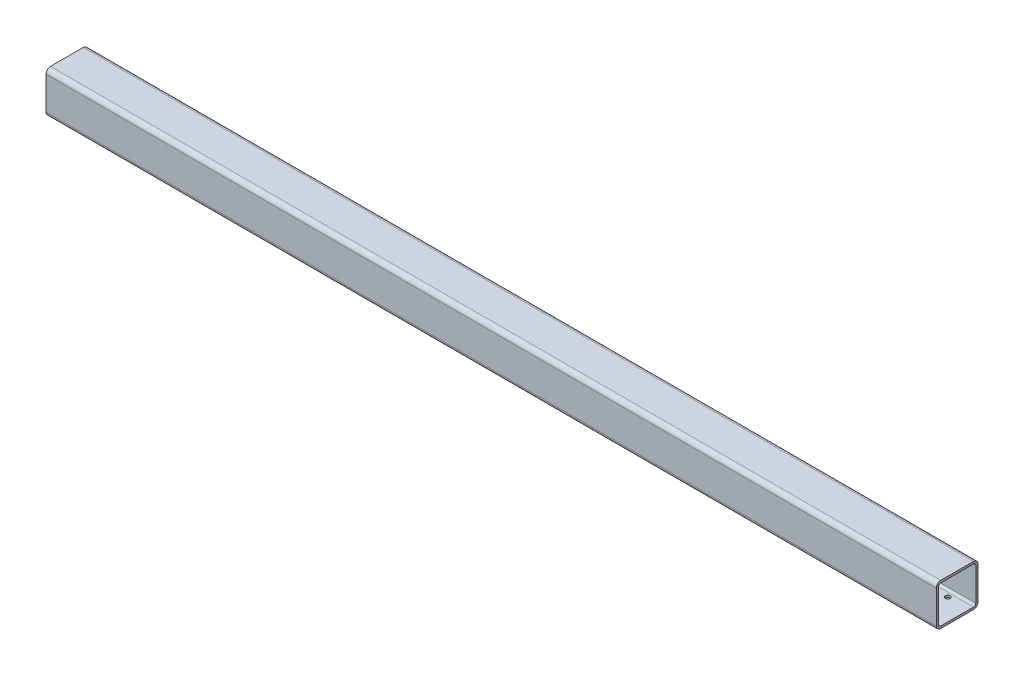
ISO-10303-21;
HEADER;
FILE_DESCRIPTION(('STEP AP214'),'2;1');
FILE_NAME('part.step','',(''),(''),'','','');
FILE_SCHEMA(('AUTOMOTIVE_DESIGN { 1 0 10303 214 1 1 1 1 }'));
ENDSEC;
DATA;
#1=APPLICATION_CONTEXT('core data for automotive mechanical design processes');
#2=APPLICATION_PROTOCOL_DEFINITION('international standard','automotive_design',2000,#1);
#3=PRODUCT_CONTEXT('',#1,'mechanical');
#4=PRODUCT('Part','Part','',(#3));
#5=PRODUCT_RELATED_PRODUCT_CATEGORY('part','',(#4));
#6=PRODUCT_DEFINITION_FORMATION('','',#4);
#7=PRODUCT_DEFINITION_CONTEXT('part definition',#1,'design');
#8=PRODUCT_DEFINITION('design','',#6,#7);
#9=PRODUCT_DEFINITION_SHAPE('','',#8);
#10=(LENGTH_UNIT() NAMED_UNIT(*) SI_UNIT(.MILLI.,.METRE.));
#11=(NAMED_UNIT(*) PLANE_ANGLE_UNIT() SI_UNIT($,.RADIAN.));
#12=(NAMED_UNIT(*) SI_UNIT($,.STERADIAN.) SOLID_ANGLE_UNIT());
#13=UNCERTAINTY_MEASURE_WITH_UNIT(LENGTH_MEASURE(1.E-05),#10,'distance_accuracy_value','');
#14=(GEOMETRIC_REPRESENTATION_CONTEXT(3) GLOBAL_UNCERTAINTY_ASSIGNED_CONTEXT((#13)) GLOBAL_UNIT_ASSIGNED_CONTEXT((#10,
#11,#12)) REPRESENTATION_CONTEXT('',''));
#15=CARTESIAN_POINT('',(0.,0.,0.));
#16=DIRECTION('',(0.,0.,1.));
#17=DIRECTION('',(1.,0.,0.));
#18=AXIS2_PLACEMENT_3D('',#15,#16,#17);
#19=CARTESIAN_POINT('',(-539.,-29.999999999859,-17.5));
#20=DIRECTION('',(0.,-1.,0.));
#21=DIRECTION('',(1.,0.,0.));
#22=AXIS2_PLACEMENT_3D('',#19,#20,#21);
#23=CONICAL_SURFACE('',#22,3.99999999983265,1.02974425864578);
#24=CARTESIAN_POINT('',(-539.,-27.5965575238217,-17.5000000002399));
#25=VERTEX_POINT('',#24);
#26=VERTEX_LOOP('',#25);
#27=FACE_BOUND('',#26,.T.);
#28=CARTESIAN_POINT('',(-539.,-29.9999999999369,-17.5));
#29=DIRECTION('',(0.,-1.,0.));
#30=DIRECTION('',(1.,0.,0.));
#31=AXIS2_PLACEMENT_3D('',#28,#29,#30);
#32=CIRCLE('',#31,3.99999999996226);
#33=CARTESIAN_POINT('',(-535.000000000037,-29.9999999999369,-17.5));
#34=VERTEX_POINT('',#33);
#35=EDGE_CURVE('E156',#34,#34,#32,.T.);
#36=ORIENTED_EDGE('',*,*,#35,.T.);
#37=EDGE_LOOP('',(#36));
#38=FACE_BOUND('',#37,.T.);
#39=ADVANCED_FACE('F17',(#27,#38),#23,.F.);
#40=CARTESIAN_POINT('',(538.999999999999,-29.999999999859,-17.5));
#41=DIRECTION('',(0.,-1.,0.));
#42=DIRECTION('',(1.,0.,0.));
#43=AXIS2_PLACEMENT_3D('',#40,#41,#42);
#44=CONICAL_SURFACE('',#43,3.99999999983265,1.02974425864578);
#45=CARTESIAN_POINT('',(538.999999999999,-27.5965575238217,-17.5000000002399));
#46=VERTEX_POINT('',#45);
#47=VERTEX_LOOP('',#46);
#48=FACE_BOUND('',#47,.T.);
#49=CARTESIAN_POINT('',(538.999999999999,-29.9999999999369,-17.5));
#50=DIRECTION('',(0.,-1.,0.));
#51=DIRECTION('',(1.,0.,0.));
#52=AXIS2_PLACEMENT_3D('',#49,#50,#51);
#53=CIRCLE('',#52,3.99999999996226);
#54=CARTESIAN_POINT('',(542.999999999961,-29.9999999999369,-17.5));
#55=VERTEX_POINT('',#54);
#56=EDGE_CURVE('E252',#55,#55,#53,.T.);
#57=ORIENTED_EDGE('',*,*,#56,.T.);
#58=EDGE_LOOP('',(#57));
#59=FACE_BOUND('',#58,.T.);
#60=ADVANCED_FACE('F410',(#48,#59),#44,.F.);
#61=CARTESIAN_POINT('',(538.999999999999,-29.999999999859,17.5000000000004));
#62=DIRECTION('',(0.,-1.,0.));
#63=DIRECTION('',(1.,0.,0.));
#64=AXIS2_PLACEMENT_3D('',#61,#62,#63);
#65=CONICAL_SURFACE('',#64,3.99999999975122,1.02974425859438);
#66=CARTESIAN_POINT('',(538.999999999999,-27.5965575238217,17.4999999998136));
#67=VERTEX_POINT('',#66);
#68=VERTEX_LOOP('',#67);
#69=FACE_BOUND('',#68,.T.);
#70=CARTESIAN_POINT('',(538.999999999999,-29.9999999999858,17.5000000000004));
#71=DIRECTION('',(0.,-1.,0.));
#72=DIRECTION('',(1.,0.,0.));
#73=AXIS2_PLACEMENT_3D('',#70,#71,#72);
#74=CIRCLE('',#73,3.99999999996226);
#75=CARTESIAN_POINT('',(542.999999999961,-29.9999999999858,17.5000000000004));
#76=VERTEX_POINT('',#75);
#77=EDGE_CURVE('E249',#76,#76,#74,.T.);
#78=ORIENTED_EDGE('',*,*,#77,.T.);
#79=EDGE_LOOP('',(#78));
#80=FACE_BOUND('',#79,.T.);
#81=ADVANCED_FACE('F296',(#69,#80),#65,.F.);
#82=CARTESIAN_POINT('',(-539.,-29.999999999859,17.4999999999993));
#83=DIRECTION('',(0.,-1.,0.));
#84=DIRECTION('',(1.,0.,0.));
#85=AXIS2_PLACEMENT_3D('',#82,#83,#84);
#86=CONICAL_SURFACE('',#85,3.99999999975011,1.02974425859413);
#87=CARTESIAN_POINT('',(-539.,-27.5965575238217,17.4999999998136));
#88=VERTEX_POINT('',#87);
#89=VERTEX_LOOP('',#88);
#90=FACE_BOUND('',#89,.T.);
#91=CARTESIAN_POINT('',(-539.,-29.9999999999865,17.4999999999993));
#92=DIRECTION('',(0.,-1.,0.));
#93=DIRECTION('',(1.,0.,0.));
#94=AXIS2_PLACEMENT_3D('',#91,#92,#93);
#95=CIRCLE('',#94,3.99999999996226);
#96=CARTESIAN_POINT('',(-535.000000000037,-29.9999999999865,17.4999999999993));
#97=VERTEX_POINT('',#96);
#98=EDGE_CURVE('E246',#97,#97,#95,.T.);
#99=ORIENTED_EDGE('',*,*,#98,.T.);
#100=EDGE_LOOP('',(#99));
#101=FACE_BOUND('',#100,.T.);
#102=ADVANCED_FACE('F285',(#90,#101),#86,.F.);
#103=CARTESIAN_POINT('',(-609.,-40.,-17.5));
#104=DIRECTION('',(0.,-1.,0.));
#105=DIRECTION('',(0.,0.,-1.));
#106=AXIS2_PLACEMENT_3D('',#103,#104,#105);
#107=CYLINDRICAL_SURFACE('',#106,3.39999999999996);
#108=CARTESIAN_POINT('',(-609.,-30.,-17.5));
#109=DIRECTION('',(0.,-1.,0.));
#110=DIRECTION('',(0.,0.,-1.));
#111=AXIS2_PLACEMENT_3D('',#108,#109,#110);
#112=CIRCLE('',#111,3.39999999999996);
#113=CARTESIAN_POINT('',(-609.,-30.,-20.9));
#114=VERTEX_POINT('',#113);
#115=EDGE_CURVE('E243',#114,#114,#112,.T.);
#116=ORIENTED_EDGE('',*,*,#115,.T.);
#117=EDGE_LOOP('',(#116));
#118=FACE_BOUND('',#117,.T.);
#119=CARTESIAN_POINT('',(-609.,-26.7999999999999,-17.5));
#120=DIRECTION('',(0.,-1.,0.));
#121=DIRECTION('',(0.,0.,-1.));
#122=AXIS2_PLACEMENT_3D('',#119,#120,#121);
#123=CIRCLE('',#122,3.39999999999996);
#124=CARTESIAN_POINT('',(-609.,-26.7999999999999,-20.9));
#125=VERTEX_POINT('',#124);
#126=EDGE_CURVE('E20',#125,#125,#123,.T.);
#127=ORIENTED_EDGE('',*,*,#126,.F.);
#128=EDGE_LOOP('',(#127));
#129=FACE_BOUND('',#128,.T.);
#130=ADVANCED_FACE('F282',(#118,#129),#107,.F.);
#131=CARTESIAN_POINT('',(-609.,-40.,17.5));
#132=DIRECTION('',(0.,-1.,0.));
#133=DIRECTION('',(0.,0.,-1.));
#134=AXIS2_PLACEMENT_3D('',#131,#132,#133);
#135=CYLINDRICAL_SURFACE('',#134,3.39999999999996);
#136=CARTESIAN_POINT('',(-609.,-30.,17.5));
#137=DIRECTION('',(0.,-1.,0.));
#138=DIRECTION('',(0.,0.,-1.));
#139=AXIS2_PLACEMENT_3D('',#136,#137,#138);
#140=CIRCLE('',#139,3.39999999999996);
#141=CARTESIAN_POINT('',(-609.,-30.,14.1));
#142=VERTEX_POINT('',#141);
#143=EDGE_CURVE('E240',#142,#142,#140,.T.);
#144=ORIENTED_EDGE('',*,*,#143,.T.);
#145=EDGE_LOOP('',(#144));
#146=FACE_BOUND('',#145,.T.);
#147=CARTESIAN_POINT('',(-609.,-26.7999999999999,17.5));
#148=DIRECTION('',(0.,-1.,0.));
#149=DIRECTION('',(0.,0.,-1.));
#150=AXIS2_PLACEMENT_3D('',#147,#148,#149);
#151=CIRCLE('',#150,3.39999999999996);
#152=CARTESIAN_POINT('',(-609.,-26.7999999999999,14.1));
#153=VERTEX_POINT('',#152);
#154=EDGE_CURVE('E273',#153,#153,#151,.T.);
#155=ORIENTED_EDGE('',*,*,#154,.F.);
#156=EDGE_LOOP('',(#155));
#157=FACE_BOUND('',#156,.T.);
#158=ADVANCED_FACE('F284',(#146,#157),#135,.F.);
#159=CARTESIAN_POINT('',(-469.,-40.,17.5));
#160=DIRECTION('',(0.,-1.,0.));
#161=DIRECTION('',(0.,0.,-1.));
#162=AXIS2_PLACEMENT_3D('',#159,#160,#161);
#163=CYLINDRICAL_SURFACE('',#162,3.40000000000001);
#164=CARTESIAN_POINT('',(-469.,-30.,17.5));
#165=DIRECTION('',(0.,-1.,0.));
#166=DIRECTION('',(0.,0.,-1.));
#167=AXIS2_PLACEMENT_3D('',#164,#165,#166);
#168=CIRCLE('',#167,3.40000000000001);
#169=CARTESIAN_POINT('',(-469.,-30.,14.1));
#170=VERTEX_POINT('',#169);
#171=EDGE_CURVE('E237',#170,#170,#168,.T.);
#172=ORIENTED_EDGE('',*,*,#171,.T.);
#173=EDGE_LOOP('',(#172));
#174=FACE_BOUND('',#173,.T.);
#175=CARTESIAN_POINT('',(-469.,-26.7999999999999,17.5));
#176=DIRECTION('',(0.,-1.,0.));
#177=DIRECTION('',(0.,0.,-1.));
#178=AXIS2_PLACEMENT_3D('',#175,#176,#177);
#179=CIRCLE('',#178,3.40000000000001);
#180=CARTESIAN_POINT('',(-469.,-26.7999999999999,14.1));
#181=VERTEX_POINT('',#180);
#182=EDGE_CURVE('E271',#181,#181,#179,.T.);
#183=ORIENTED_EDGE('',*,*,#182,.F.);
#184=EDGE_LOOP('',(#183));
#185=FACE_BOUND('',#184,.T.);
#186=ADVANCED_FACE('F293',(#174,#185),#163,.F.);
#187=CARTESIAN_POINT('',(-469.,-40.,-17.5));
#188=DIRECTION('',(0.,-1.,0.));
#189=DIRECTION('',(0.,0.,-1.));
#190=AXIS2_PLACEMENT_3D('',#187,#188,#189);
#191=CYLINDRICAL_SURFACE('',#190,3.40000000000001);
#192=CARTESIAN_POINT('',(-469.,-30.,-17.5));
#193=DIRECTION('',(0.,-1.,0.));
#194=DIRECTION('',(0.,0.,-1.));
#195=AXIS2_PLACEMENT_3D('',#192,#193,#194);
#196=CIRCLE('',#195,3.40000000000001);
#197=CARTESIAN_POINT('',(-469.,-30.,-20.9));
#198=VERTEX_POINT('',#197);
#199=EDGE_CURVE('E234',#198,#198,#196,.T.);
#200=ORIENTED_EDGE('',*,*,#199,.T.);
#201=EDGE_LOOP('',(#200));
#202=FACE_BOUND('',#201,.T.);
#203=CARTESIAN_POINT('',(-469.,-26.7999999999999,-17.5));
#204=DIRECTION('',(0.,-1.,0.));
#205=DIRECTION('',(0.,0.,-1.));
#206=AXIS2_PLACEMENT_3D('',#203,#204,#205);
#207=CIRCLE('',#206,3.40000000000001);
#208=CARTESIAN_POINT('',(-469.,-26.7999999999999,-20.9));
#209=VERTEX_POINT('',#208);
#210=EDGE_CURVE('E268',#209,#209,#207,.T.);
#211=ORIENTED_EDGE('',*,*,#210,.F.);
#212=EDGE_LOOP('',(#211));
#213=FACE_BOUND('',#212,.T.);
#214=ADVANCED_FACE('F382',(#202,#213),#191,.F.);
#215=CARTESIAN_POINT('',(469.,-40.,-17.5));
#216=DIRECTION('',(0.,-1.,0.));
#217=DIRECTION('',(0.,0.,-1.));
#218=AXIS2_PLACEMENT_3D('',#215,#216,#217);
#219=CYLINDRICAL_SURFACE('',#218,3.40000000000001);
#220=CARTESIAN_POINT('',(469.,-30.,-17.5));
#221=DIRECTION('',(0.,-1.,0.));
#222=DIRECTION('',(0.,0.,-1.));
#223=AXIS2_PLACEMENT_3D('',#220,#221,#222);
#224=CIRCLE('',#223,3.40000000000001);
#225=CARTESIAN_POINT('',(469.,-30.,-20.9));
#226=VERTEX_POINT('',#225);
#227=EDGE_CURVE('E231',#226,#226,#224,.T.);
#228=ORIENTED_EDGE('',*,*,#227,.T.);
#229=EDGE_LOOP('',(#228));
#230=FACE_BOUND('',#229,.T.);
#231=CARTESIAN_POINT('',(469.,-26.7999999999999,-17.5));
#232=DIRECTION('',(0.,-1.,0.));
#233=DIRECTION('',(0.,0.,-1.));
#234=AXIS2_PLACEMENT_3D('',#231,#232,#233);
#235=CIRCLE('',#234,3.40000000000001);
#236=CARTESIAN_POINT('',(469.,-26.7999999999999,-20.9));
#237=VERTEX_POINT('',#236);
#238=EDGE_CURVE('E265',#237,#237,#235,.T.);
#239=ORIENTED_EDGE('',*,*,#238,.F.);
#240=EDGE_LOOP('',(#239));
#241=FACE_BOUND('',#240,.T.);
#242=ADVANCED_FACE('F378',(#230,#241),#219,.F.);
#243=CARTESIAN_POINT('',(609.,-40.,-17.5));
#244=DIRECTION('',(0.,-1.,0.));
#245=DIRECTION('',(0.,0.,-1.));
#246=AXIS2_PLACEMENT_3D('',#243,#244,#245);
#247=CYLINDRICAL_SURFACE('',#246,3.39999999999996);
#248=CARTESIAN_POINT('',(609.,-30.,-17.5));
#249=DIRECTION('',(0.,-1.,0.));
#250=DIRECTION('',(0.,0.,-1.));
#251=AXIS2_PLACEMENT_3D('',#248,#249,#250);
#252=CIRCLE('',#251,3.39999999999996);
#253=CARTESIAN_POINT('',(609.,-30.,-20.9));
#254=VERTEX_POINT('',#253);
#255=EDGE_CURVE('E228',#254,#254,#252,.T.);
#256=ORIENTED_EDGE('',*,*,#255,.T.);
#257=EDGE_LOOP('',(#256));
#258=FACE_BOUND('',#257,.T.);
#259=CARTESIAN_POINT('',(609.,-26.7999999999999,-17.5));
#260=DIRECTION('',(0.,-1.,0.));
#261=DIRECTION('',(0.,0.,-1.));
#262=AXIS2_PLACEMENT_3D('',#259,#260,#261);
#263=CIRCLE('',#262,3.39999999999996);
#264=CARTESIAN_POINT('',(609.,-26.7999999999999,-20.9));
#265=VERTEX_POINT('',#264);
#266=EDGE_CURVE('E262',#265,#265,#263,.T.);
#267=ORIENTED_EDGE('',*,*,#266,.F.);
#268=EDGE_LOOP('',(#267));
#269=FACE_BOUND('',#268,.T.);
#270=ADVANCED_FACE('F374',(#258,#269),#247,.F.);
#271=CARTESIAN_POINT('',(609.,-40.,17.5));
#272=DIRECTION('',(0.,-1.,0.));
#273=DIRECTION('',(0.,0.,-1.));
#274=AXIS2_PLACEMENT_3D('',#271,#272,#273);
#275=CYLINDRICAL_SURFACE('',#274,3.39999999999996);
#276=CARTESIAN_POINT('',(609.,-30.,17.5));
#277=DIRECTION('',(0.,-1.,0.));
#278=DIRECTION('',(0.,0.,-1.));
#279=AXIS2_PLACEMENT_3D('',#276,#277,#278);
#280=CIRCLE('',#279,3.39999999999996);
#281=CARTESIAN_POINT('',(609.,-30.,14.1));
#282=VERTEX_POINT('',#281);
#283=EDGE_CURVE('E225',#282,#282,#280,.T.);
#284=ORIENTED_EDGE('',*,*,#283,.T.);
#285=EDGE_LOOP('',(#284));
#286=FACE_BOUND('',#285,.T.);
#287=CARTESIAN_POINT('',(609.,-26.7999999999999,17.5));
#288=DIRECTION('',(0.,-1.,0.));
#289=DIRECTION('',(0.,0.,-1.));
#290=AXIS2_PLACEMENT_3D('',#287,#288,#289);
#291=CIRCLE('',#290,3.39999999999996);
#292=CARTESIAN_POINT('',(609.,-26.7999999999999,14.1));
#293=VERTEX_POINT('',#292);
#294=EDGE_CURVE('E259',#293,#293,#291,.T.);
#295=ORIENTED_EDGE('',*,*,#294,.F.);
#296=EDGE_LOOP('',(#295));
#297=FACE_BOUND('',#296,.T.);
#298=ADVANCED_FACE('F370',(#286,#297),#275,.F.);
#299=CARTESIAN_POINT('',(469.,-40.,17.5));
#300=DIRECTION('',(0.,-1.,0.));
#301=DIRECTION('',(0.,0.,-1.));
#302=AXIS2_PLACEMENT_3D('',#299,#300,#301);
#303=CYLINDRICAL_SURFACE('',#302,3.40000000000001);
#304=CARTESIAN_POINT('',(469.,-30.,17.5));
#305=DIRECTION('',(0.,-1.,0.));
#306=DIRECTION('',(0.,0.,-1.));
#307=AXIS2_PLACEMENT_3D('',#304,#305,#306);
#308=CIRCLE('',#307,3.40000000000001);
#309=CARTESIAN_POINT('',(469.,-30.,14.1));
#310=VERTEX_POINT('',#309);
#311=EDGE_CURVE('E153',#310,#310,#308,.T.);
#312=ORIENTED_EDGE('',*,*,#311,.T.);
#313=EDGE_LOOP('',(#312));
#314=FACE_BOUND('',#313,.T.);
#315=CARTESIAN_POINT('',(469.,-26.7999999999999,17.5));
#316=DIRECTION('',(0.,-1.,0.));
#317=DIRECTION('',(0.,0.,-1.));
#318=AXIS2_PLACEMENT_3D('',#315,#316,#317);
#319=CIRCLE('',#318,3.40000000000001);
#320=CARTESIAN_POINT('',(469.,-26.7999999999999,14.1));
#321=VERTEX_POINT('',#320);
#322=EDGE_CURVE('E182',#321,#321,#319,.T.);
#323=ORIENTED_EDGE('',*,*,#322,.F.);
#324=EDGE_LOOP('',(#323));
#325=FACE_BOUND('',#324,.T.);
#326=ADVANCED_FACE('F366',(#314,#325),#303,.F.);
#327=CARTESIAN_POINT('',(670.,-23.6000000000001,23.6));
#328=DIRECTION('',(-1.,0.,0.));
#329=DIRECTION('',(0.,0.,1.));
#330=AXIS2_PLACEMENT_3D('',#327,#328,#329);
#331=CYLINDRICAL_SURFACE('',#330,3.19999999999993);
#332=CARTESIAN_POINT('',(-640.,-23.6000000000001,23.6));
#333=DIRECTION('',(-1.,0.,0.));
#334=DIRECTION('',(0.,0.,1.));
#335=AXIS2_PLACEMENT_3D('',#332,#333,#334);
#336=CIRCLE('',#335,3.19999999999993);
#337=CARTESIAN_POINT('',(-640.,-23.6000000000001,26.7999999999999));
#338=VERTEX_POINT('',#337);
#339=CARTESIAN_POINT('',(-640.,-26.7999999999999,23.6));
#340=VERTEX_POINT('',#339);
#341=EDGE_CURVE('E205',#338,#340,#336,.F.);
#342=ORIENTED_EDGE('',*,*,#341,.F.);
#343=DIRECTION('',(1.,0.,0.));
#344=VECTOR('',#343,1.);
#345=CARTESIAN_POINT('',(670.,-23.6000000000001,26.7999999999999));
#346=LINE('',#345,#344);
#347=CARTESIAN_POINT('',(640.,-23.6000000000001,26.7999999999999));
#348=VERTEX_POINT('',#347);
#349=EDGE_CURVE('E170',#348,#338,#346,.F.);
#350=ORIENTED_EDGE('',*,*,#349,.F.);
#351=CARTESIAN_POINT('',(640.,-23.6000000000001,23.6));
#352=DIRECTION('',(-1.,0.,0.));
#353=DIRECTION('',(0.,0.,1.));
#354=AXIS2_PLACEMENT_3D('',#351,#352,#353);
#355=CIRCLE('',#354,3.19999999999993);
#356=CARTESIAN_POINT('',(640.,-26.7999999999999,23.6));
#357=VERTEX_POINT('',#356);
#358=EDGE_CURVE('E221',#357,#348,#355,.T.);
#359=ORIENTED_EDGE('',*,*,#358,.F.);
#360=DIRECTION('',(1.,0.,0.));
#361=VECTOR('',#360,1.);
#362=CARTESIAN_POINT('',(670.,-26.7999999999999,23.6));
#363=LINE('',#362,#361);
#364=EDGE_CURVE('E180',#340,#357,#363,.T.);
#365=ORIENTED_EDGE('',*,*,#364,.F.);
#366=EDGE_LOOP('',(#342,#350,#359,#365));
#367=FACE_BOUND('',#366,.T.);
#368=ADVANCED_FACE('F362',(#367),#331,.F.);
#369=CARTESIAN_POINT('',(670.,-26.7999999999999,23.6));
#370=DIRECTION('',(0.,1.,0.));
#371=DIRECTION('',(0.,0.,1.));
#372=AXIS2_PLACEMENT_3D('',#369,#370,#371);
#373=PLANE('',#372);
#374=ORIENTED_EDGE('',*,*,#364,.T.);
#375=DIRECTION('',(0.,0.,-1.));
#376=VECTOR('',#375,1.);
#377=CARTESIAN_POINT('',(640.,-26.7999999999999,1170.));
#378=LINE('',#377,#376);
#379=CARTESIAN_POINT('',(640.,-26.8,-23.6));
#380=VERTEX_POINT('',#379);
#381=EDGE_CURVE('E143',#380,#357,#378,.F.);
#382=ORIENTED_EDGE('',*,*,#381,.F.);
#383=DIRECTION('',(-1.,0.,0.));
#384=VECTOR('',#383,1.);
#385=CARTESIAN_POINT('',(670.,-26.8,-23.6));
#386=LINE('',#385,#384);
#387=CARTESIAN_POINT('',(-640.,-26.8,-23.6));
#388=VERTEX_POINT('',#387);
#389=EDGE_CURVE('E177',#380,#388,#386,.T.);
#390=ORIENTED_EDGE('',*,*,#389,.T.);
#391=DIRECTION('',(0.,0.,1.));
#392=VECTOR('',#391,1.);
#393=CARTESIAN_POINT('',(-640.,-26.7999999999999,1170.));
#394=LINE('',#393,#392);
#395=EDGE_CURVE('E204',#340,#388,#394,.F.);
#396=ORIENTED_EDGE('',*,*,#395,.F.);
#397=EDGE_LOOP('',(#374,#382,#390,#396));
#398=FACE_BOUND('',#397,.T.);
#399=ORIENTED_EDGE('',*,*,#322,.T.);
#400=EDGE_LOOP('',(#399));
#401=FACE_BOUND('',#400,.T.);
#402=ORIENTED_EDGE('',*,*,#294,.T.);
#403=EDGE_LOOP('',(#402));
#404=FACE_BOUND('',#403,.T.);
#405=ORIENTED_EDGE('',*,*,#266,.T.);
#406=EDGE_LOOP('',(#405));
#407=FACE_BOUND('',#406,.T.);
#408=ORIENTED_EDGE('',*,*,#238,.T.);
#409=EDGE_LOOP('',(#408));
#410=FACE_BOUND('',#409,.T.);
#411=ORIENTED_EDGE('',*,*,#210,.T.);
#412=EDGE_LOOP('',(#411));
#413=FACE_BOUND('',#412,.T.);
#414=ORIENTED_EDGE('',*,*,#182,.T.);
#415=EDGE_LOOP('',(#414));
#416=FACE_BOUND('',#415,.T.);
#417=ORIENTED_EDGE('',*,*,#154,.T.);
#418=EDGE_LOOP('',(#417));
#419=FACE_BOUND('',#418,.T.);
#420=ORIENTED_EDGE('',*,*,#126,.T.);
#421=EDGE_LOOP('',(#420));
#422=FACE_BOUND('',#421,.T.);
#423=ADVANCED_FACE('F280',(#398,#401,#404,#407,#410,#413,#416,#419,#422),#373,.T.);
#424=CARTESIAN_POINT('',(670.,-23.6000000000001,-23.6));
#425=DIRECTION('',(-1.,0.,0.));
#426=DIRECTION('',(0.,0.,1.));
#427=AXIS2_PLACEMENT_3D('',#424,#425,#426);
#428=CYLINDRICAL_SURFACE('',#427,3.19999999999998);
#429=CARTESIAN_POINT('',(-640.,-23.6000000000001,-23.6));
#430=DIRECTION('',(-1.,0.,0.));
#431=DIRECTION('',(0.,0.,1.));
#432=AXIS2_PLACEMENT_3D('',#429,#430,#431);
#433=CIRCLE('',#432,3.19999999999998);
#434=CARTESIAN_POINT('',(-640.,-23.6000000000001,-26.8000000000001));
#435=VERTEX_POINT('',#434);
#436=EDGE_CURVE('E202',#388,#435,#433,.F.);
#437=ORIENTED_EDGE('',*,*,#436,.F.);
#438=ORIENTED_EDGE('',*,*,#389,.F.);
#439=CARTESIAN_POINT('',(640.,-23.6000000000001,-23.6));
#440=DIRECTION('',(-1.,0.,0.));
#441=DIRECTION('',(0.,0.,1.));
#442=AXIS2_PLACEMENT_3D('',#439,#440,#441);
#443=CIRCLE('',#442,3.19999999999998);
#444=CARTESIAN_POINT('',(640.,-23.6000000000001,-26.8000000000001));
#445=VERTEX_POINT('',#444);
#446=EDGE_CURVE('E141',#445,#380,#443,.T.);
#447=ORIENTED_EDGE('',*,*,#446,.F.);
#448=DIRECTION('',(1.,0.,0.));
#449=VECTOR('',#448,1.);
#450=CARTESIAN_POINT('',(670.,-23.6000000000001,-26.8000000000001));
#451=LINE('',#450,#449);
#452=EDGE_CURVE('E127',#435,#445,#451,.T.);
#453=ORIENTED_EDGE('',*,*,#452,.F.);
#454=EDGE_LOOP('',(#437,#438,#447,#453));
#455=FACE_BOUND('',#454,.T.);
#456=ADVANCED_FACE('F356',(#455),#428,.F.);
#457=CARTESIAN_POINT('',(670.,23.6000000000001,-26.8));
#458=DIRECTION('',(0.,0.,1.));
#459=DIRECTION('',(0.,-1.,0.));
#460=AXIS2_PLACEMENT_3D('',#457,#458,#459);
#461=PLANE('',#460);
#462=ORIENTED_EDGE('',*,*,#452,.T.);
#463=DIRECTION('',(0.,1.,0.));
#464=VECTOR('',#463,1.);
#465=CARTESIAN_POINT('',(640.,-23.6000000000001,-26.8000000000002));
#466=LINE('',#465,#464);
#467=CARTESIAN_POINT('',(640.,23.6000000000001,-26.8));
#468=VERTEX_POINT('',#467);
#469=EDGE_CURVE('E134',#468,#445,#466,.F.);
#470=ORIENTED_EDGE('',*,*,#469,.F.);
#471=DIRECTION('',(-1.,0.,0.));
#472=VECTOR('',#471,1.);
#473=CARTESIAN_POINT('',(670.,23.6000000000001,-26.7999999999999));
#474=LINE('',#473,#472);
#475=CARTESIAN_POINT('',(-640.,23.6000000000001,-26.8));
#476=VERTEX_POINT('',#475);
#477=EDGE_CURVE('E119',#468,#476,#474,.T.);
#478=ORIENTED_EDGE('',*,*,#477,.T.);
#479=DIRECTION('',(0.,1.,0.));
#480=VECTOR('',#479,1.);
#481=CARTESIAN_POINT('',(-640.,23.6000000000001,-26.8000000000002));
#482=LINE('',#481,#480);
#483=EDGE_CURVE('E201',#435,#476,#482,.T.);
#484=ORIENTED_EDGE('',*,*,#483,.F.);
#485=EDGE_LOOP('',(#462,#470,#478,#484));
#486=FACE_BOUND('',#485,.T.);
#487=ADVANCED_FACE('F139',(#486),#461,.T.);
#488=CARTESIAN_POINT('',(670.,23.6000000000001,-23.6));
#489=DIRECTION('',(-1.,0.,0.));
#490=DIRECTION('',(0.,0.,1.));
#491=AXIS2_PLACEMENT_3D('',#488,#489,#490);
#492=CYLINDRICAL_SURFACE('',#491,3.19999999999998);
#493=CARTESIAN_POINT('',(-640.,23.6000000000001,-23.6));
#494=DIRECTION('',(-1.,0.,0.));
#495=DIRECTION('',(0.,0.,1.));
#496=AXIS2_PLACEMENT_3D('',#493,#494,#495);
#497=CIRCLE('',#496,3.19999999999998);
#498=CARTESIAN_POINT('',(-640.,26.7999999999999,-23.6));
#499=VERTEX_POINT('',#498);
#500=EDGE_CURVE('E123',#476,#499,#497,.F.);
#501=ORIENTED_EDGE('',*,*,#500,.F.);
#502=ORIENTED_EDGE('',*,*,#477,.F.);
#503=CARTESIAN_POINT('',(640.,23.6000000000001,-23.6));
#504=DIRECTION('',(-1.,0.,0.));
#505=DIRECTION('',(0.,0.,1.));
#506=AXIS2_PLACEMENT_3D('',#503,#504,#505);
#507=CIRCLE('',#506,3.19999999999998);
#508=CARTESIAN_POINT('',(640.,26.7999999999999,-23.6));
#509=VERTEX_POINT('',#508);
#510=EDGE_CURVE('E122',#509,#468,#507,.T.);
#511=ORIENTED_EDGE('',*,*,#510,.F.);
#512=DIRECTION('',(1.,0.,0.));
#513=VECTOR('',#512,1.);
#514=CARTESIAN_POINT('',(670.,26.7999999999999,-23.6));
#515=LINE('',#514,#513);
#516=EDGE_CURVE('E112',#499,#509,#515,.T.);
#517=ORIENTED_EDGE('',*,*,#516,.F.);
#518=EDGE_LOOP('',(#501,#502,#511,#517));
#519=FACE_BOUND('',#518,.T.);
#520=ADVANCED_FACE('F121',(#519),#492,.F.);
#521=CARTESIAN_POINT('',(670.,26.7999999999999,-23.6));
#522=DIRECTION('',(0.,-1.,0.));
#523=DIRECTION('',(0.,0.,-1.));
#524=AXIS2_PLACEMENT_3D('',#521,#522,#523);
#525=PLANE('',#524);
#526=ORIENTED_EDGE('',*,*,#516,.T.);
#527=DIRECTION('',(0.,0.,-1.));
#528=VECTOR('',#527,1.);
#529=CARTESIAN_POINT('',(640.,26.7999999999999,1170.));
#530=LINE('',#529,#528);
#531=CARTESIAN_POINT('',(640.,26.8,23.6));
#532=VERTEX_POINT('',#531);
#533=EDGE_CURVE('E137',#532,#509,#530,.T.);
#534=ORIENTED_EDGE('',*,*,#533,.F.);
#535=DIRECTION('',(-1.,0.,0.));
#536=VECTOR('',#535,1.);
#537=CARTESIAN_POINT('',(670.,26.8,23.6));
#538=LINE('',#537,#536);
#539=CARTESIAN_POINT('',(-640.,26.8,23.6));
#540=VERTEX_POINT('',#539);
#541=EDGE_CURVE('E172',#532,#540,#538,.T.);
#542=ORIENTED_EDGE('',*,*,#541,.T.);
#543=DIRECTION('',(0.,0.,1.));
#544=VECTOR('',#543,1.);
#545=CARTESIAN_POINT('',(-640.,26.7999999999999,1170.));
#546=LINE('',#545,#544);
#547=EDGE_CURVE('E199',#499,#540,#546,.T.);
#548=ORIENTED_EDGE('',*,*,#547,.F.);
#549=EDGE_LOOP('',(#526,#534,#542,#548));
#550=FACE_BOUND('',#549,.T.);
#551=ADVANCED_FACE('F348',(#550),#525,.T.);
#552=CARTESIAN_POINT('',(670.,23.6000000000001,23.6));
#553=DIRECTION('',(-1.,0.,0.));
#554=DIRECTION('',(0.,0.,1.));
#555=AXIS2_PLACEMENT_3D('',#552,#553,#554);
#556=CYLINDRICAL_SURFACE('',#555,3.19999999999998);
#557=CARTESIAN_POINT('',(-640.,23.6000000000001,23.6));
#558=DIRECTION('',(-1.,0.,0.));
#559=DIRECTION('',(0.,0.,1.));
#560=AXIS2_PLACEMENT_3D('',#557,#558,#559);
#561=CIRCLE('',#560,3.19999999999998);
#562=CARTESIAN_POINT('',(-640.,23.6000000000001,26.8));
#563=VERTEX_POINT('',#562);
#564=EDGE_CURVE('E197',#540,#563,#561,.F.);
#565=ORIENTED_EDGE('',*,*,#564,.F.);
#566=ORIENTED_EDGE('',*,*,#541,.F.);
#567=CARTESIAN_POINT('',(640.,23.6000000000001,23.6));
#568=DIRECTION('',(-1.,0.,0.));
#569=DIRECTION('',(0.,0.,1.));
#570=AXIS2_PLACEMENT_3D('',#567,#568,#569);
#571=CIRCLE('',#570,3.19999999999998);
#572=CARTESIAN_POINT('',(640.,23.6000000000001,26.8));
#573=VERTEX_POINT('',#572);
#574=EDGE_CURVE('E218',#573,#532,#571,.T.);
#575=ORIENTED_EDGE('',*,*,#574,.F.);
#576=DIRECTION('',(1.,0.,0.));
#577=VECTOR('',#576,1.);
#578=CARTESIAN_POINT('',(670.,23.6000000000001,26.8000000000001));
#579=LINE('',#578,#577);
#580=EDGE_CURVE('E162',#563,#573,#579,.T.);
#581=ORIENTED_EDGE('',*,*,#580,.F.);
#582=EDGE_LOOP('',(#565,#566,#575,#581));
#583=FACE_BOUND('',#582,.T.);
#584=ADVANCED_FACE('F344',(#583),#556,.F.);
#585=CARTESIAN_POINT('',(670.,-23.6000000000001,26.7999999999999));
#586=DIRECTION('',(0.,0.,-1.));
#587=DIRECTION('',(0.,1.,0.));
#588=AXIS2_PLACEMENT_3D('',#585,#586,#587);
#589=PLANE('',#588);
#590=ORIENTED_EDGE('',*,*,#580,.T.);
#591=DIRECTION('',(0.,1.,0.));
#592=VECTOR('',#591,1.);
#593=CARTESIAN_POINT('',(640.,-23.6000000000001,26.7999999999999));
#594=LINE('',#593,#592);
#595=EDGE_CURVE('E220',#348,#573,#594,.T.);
#596=ORIENTED_EDGE('',*,*,#595,.F.);
#597=ORIENTED_EDGE('',*,*,#349,.T.);
#598=DIRECTION('',(0.,1.,0.));
#599=VECTOR('',#598,1.);
#600=CARTESIAN_POINT('',(-640.,23.6000000000001,26.7999999999999));
#601=LINE('',#600,#599);
#602=EDGE_CURVE('E196',#563,#338,#601,.F.);
#603=ORIENTED_EDGE('',*,*,#602,.F.);
#604=EDGE_LOOP('',(#590,#596,#597,#603));
#605=FACE_BOUND('',#604,.T.);
#606=ADVANCED_FACE('F340',(#605),#589,.T.);
#607=CARTESIAN_POINT('',(670.,30.,-23.6));
#608=DIRECTION('',(0.,-1.,0.));
#609=DIRECTION('',(0.,0.,-1.));
#610=AXIS2_PLACEMENT_3D('',#607,#608,#609);
#611=PLANE('',#610);
#612=DIRECTION('',(-1.,0.,0.));
#613=VECTOR('',#612,1.);
#614=CARTESIAN_POINT('',(670.,30.0000000000001,23.6));
#615=LINE('',#614,#613);
#616=CARTESIAN_POINT('',(640.,30.0000000000001,23.6));
#617=VERTEX_POINT('',#616);
#618=CARTESIAN_POINT('',(-640.,30.0000000000001,23.6));
#619=VERTEX_POINT('',#618);
#620=EDGE_CURVE('E149',#617,#619,#615,.T.);
#621=ORIENTED_EDGE('',*,*,#620,.F.);
#622=DIRECTION('',(0.,0.,-1.));
#623=VECTOR('',#622,1.);
#624=CARTESIAN_POINT('',(640.,30.,1170.));
#625=LINE('',#624,#623);
#626=CARTESIAN_POINT('',(640.,30.0000000000001,-23.6));
#627=VERTEX_POINT('',#626);
#628=EDGE_CURVE('E168',#627,#617,#625,.F.);
#629=ORIENTED_EDGE('',*,*,#628,.F.);
#630=DIRECTION('',(-1.,0.,0.));
#631=VECTOR('',#630,1.);
#632=CARTESIAN_POINT('',(670.,30.0000000000001,-23.6));
#633=LINE('',#632,#631);
#634=CARTESIAN_POINT('',(-640.,30.0000000000001,-23.6));
#635=VERTEX_POINT('',#634);
#636=EDGE_CURVE('E160',#635,#627,#633,.F.);
#637=ORIENTED_EDGE('',*,*,#636,.F.);
#638=DIRECTION('',(0.,0.,1.));
#639=VECTOR('',#638,1.);
#640=CARTESIAN_POINT('',(-640.,30.,1170.));
#641=LINE('',#640,#639);
#642=EDGE_CURVE('E191',#619,#635,#641,.F.);
#643=ORIENTED_EDGE('',*,*,#642,.F.);
#644=EDGE_LOOP('',(#621,#629,#637,#643));
#645=FACE_BOUND('',#644,.T.);
#646=ADVANCED_FACE('F336',(#645),#611,.F.);
#647=CARTESIAN_POINT('',(670.,23.6000000000001,-23.6));
#648=DIRECTION('',(-1.,0.,0.));
#649=DIRECTION('',(0.,0.,1.));
#650=AXIS2_PLACEMENT_3D('',#647,#648,#649);
#651=CYLINDRICAL_SURFACE('',#650,6.40000000000002);
#652=CARTESIAN_POINT('',(640.,23.6000000000001,-23.6));
#653=DIRECTION('',(-1.,0.,0.));
#654=DIRECTION('',(0.,0.,1.));
#655=AXIS2_PLACEMENT_3D('',#652,#653,#654);
#656=CIRCLE('',#655,6.40000000000002);
#657=CARTESIAN_POINT('',(640.,23.6000000000001,-30.));
#658=VERTEX_POINT('',#657);
#659=EDGE_CURVE('E208',#658,#627,#656,.F.);
#660=ORIENTED_EDGE('',*,*,#659,.F.);
#661=DIRECTION('',(1.,0.,0.));
#662=VECTOR('',#661,1.);
#663=CARTESIAN_POINT('',(670.,23.6000000000001,-30.));
#664=LINE('',#663,#662);
#665=CARTESIAN_POINT('',(-640.,23.6000000000001,-30.));
#666=VERTEX_POINT('',#665);
#667=EDGE_CURVE('E157',#658,#666,#664,.F.);
#668=ORIENTED_EDGE('',*,*,#667,.T.);
#669=CARTESIAN_POINT('',(-640.,23.6000000000001,-23.6));
#670=DIRECTION('',(-1.,0.,0.));
#671=DIRECTION('',(0.,0.,1.));
#672=AXIS2_PLACEMENT_3D('',#669,#670,#671);
#673=CIRCLE('',#672,6.40000000000002);
#674=EDGE_CURVE('E188',#635,#666,#673,.T.);
#675=ORIENTED_EDGE('',*,*,#674,.F.);
#676=ORIENTED_EDGE('',*,*,#636,.T.);
#677=EDGE_LOOP('',(#660,#668,#675,#676));
#678=FACE_BOUND('',#677,.T.);
#679=ADVANCED_FACE('F332',(#678),#651,.T.);
#680=CARTESIAN_POINT('',(670.,23.6000000000001,-30.));
#681=DIRECTION('',(0.,0.,1.));
#682=DIRECTION('',(0.,-1.,0.));
#683=AXIS2_PLACEMENT_3D('',#680,#681,#682);
#684=PLANE('',#683);
#685=ORIENTED_EDGE('',*,*,#667,.F.);
#686=DIRECTION('',(0.,1.,0.));
#687=VECTOR('',#686,1.);
#688=CARTESIAN_POINT('',(640.,-23.6000000000001,-30.));
#689=LINE('',#688,#687);
#690=CARTESIAN_POINT('',(640.,-23.6000000000001,-30.));
#691=VERTEX_POINT('',#690);
#692=EDGE_CURVE('E211',#691,#658,#689,.T.);
#693=ORIENTED_EDGE('',*,*,#692,.F.);
#694=DIRECTION('',(-1.,0.,0.));
#695=VECTOR('',#694,1.);
#696=CARTESIAN_POINT('',(670.,-23.6000000000001,-30.));
#697=LINE('',#696,#695);
#698=CARTESIAN_POINT('',(-640.,-23.6000000000001,-30.));
#699=VERTEX_POINT('',#698);
#700=EDGE_CURVE('E154',#699,#691,#697,.F.);
#701=ORIENTED_EDGE('',*,*,#700,.F.);
#702=DIRECTION('',(0.,1.,0.));
#703=VECTOR('',#702,1.);
#704=CARTESIAN_POINT('',(-640.,23.6000000000001,-30.));
#705=LINE('',#704,#703);
#706=EDGE_CURVE('E187',#666,#699,#705,.F.);
#707=ORIENTED_EDGE('',*,*,#706,.F.);
#708=EDGE_LOOP('',(#685,#693,#701,#707));
#709=FACE_BOUND('',#708,.T.);
#710=ADVANCED_FACE('F328',(#709),#684,.F.);
#711=CARTESIAN_POINT('',(670.,-23.6000000000001,-23.6));
#712=DIRECTION('',(-1.,0.,0.));
#713=DIRECTION('',(0.,0.,1.));
#714=AXIS2_PLACEMENT_3D('',#711,#712,#713);
#715=CYLINDRICAL_SURFACE('',#714,6.40000000000002);
#716=CARTESIAN_POINT('',(640.,-23.6000000000001,-23.6));
#717=DIRECTION('',(-1.,0.,0.));
#718=DIRECTION('',(0.,0.,1.));
#719=AXIS2_PLACEMENT_3D('',#716,#717,#718);
#720=CIRCLE('',#719,6.40000000000002);
#721=CARTESIAN_POINT('',(640.,-30.,-23.6));
#722=VERTEX_POINT('',#721);
#723=EDGE_CURVE('E212',#722,#691,#720,.F.);
#724=ORIENTED_EDGE('',*,*,#723,.F.);
#725=DIRECTION('',(1.,0.,0.));
#726=VECTOR('',#725,1.);
#727=CARTESIAN_POINT('',(670.,-30.,-23.6));
#728=LINE('',#727,#726);
#729=CARTESIAN_POINT('',(-640.,-30.,-23.6));
#730=VERTEX_POINT('',#729);
#731=EDGE_CURVE('E150',#722,#730,#728,.F.);
#732=ORIENTED_EDGE('',*,*,#731,.T.);
#733=CARTESIAN_POINT('',(-640.,-23.6000000000001,-23.6));
#734=DIRECTION('',(-1.,0.,0.));
#735=DIRECTION('',(0.,0.,1.));
#736=AXIS2_PLACEMENT_3D('',#733,#734,#735);
#737=CIRCLE('',#736,6.40000000000002);
#738=EDGE_CURVE('E183',#699,#730,#737,.T.);
#739=ORIENTED_EDGE('',*,*,#738,.F.);
#740=ORIENTED_EDGE('',*,*,#700,.T.);
#741=EDGE_LOOP('',(#724,#732,#739,#740));
#742=FACE_BOUND('',#741,.T.);
#743=ADVANCED_FACE('F324',(#742),#715,.T.);
#744=CARTESIAN_POINT('',(670.,-30.,23.6));
#745=DIRECTION('',(0.,1.,0.));
#746=DIRECTION('',(0.,0.,1.));
#747=AXIS2_PLACEMENT_3D('',#744,#745,#746);
#748=PLANE('',#747);
#749=ORIENTED_EDGE('',*,*,#731,.F.);
#750=DIRECTION('',(0.,0.,-1.));
#751=VECTOR('',#750,1.);
#752=CARTESIAN_POINT('',(640.,-30.,1170.));
#753=LINE('',#752,#751);
#754=CARTESIAN_POINT('',(640.,-30.0000000000001,23.6));
#755=VERTEX_POINT('',#754);
#756=EDGE_CURVE('E215',#755,#722,#753,.T.);
#757=ORIENTED_EDGE('',*,*,#756,.F.);
#758=DIRECTION('',(-1.,0.,0.));
#759=VECTOR('',#758,1.);
#760=CARTESIAN_POINT('',(670.,-30.0000000000001,23.6));
#761=LINE('',#760,#759);
#762=CARTESIAN_POINT('',(-640.,-30.0000000000001,23.6));
#763=VERTEX_POINT('',#762);
#764=EDGE_CURVE('E165',#763,#755,#761,.F.);
#765=ORIENTED_EDGE('',*,*,#764,.F.);
#766=DIRECTION('',(0.,0.,1.));
#767=VECTOR('',#766,1.);
#768=CARTESIAN_POINT('',(-640.,-30.,1170.));
#769=LINE('',#768,#767);
#770=EDGE_CURVE('E186',#730,#763,#769,.T.);
#771=ORIENTED_EDGE('',*,*,#770,.F.);
#772=EDGE_LOOP('',(#749,#757,#765,#771));
#773=FACE_BOUND('',#772,.T.);
#774=ORIENTED_EDGE('',*,*,#311,.F.);
#775=EDGE_LOOP('',(#774));
#776=FACE_BOUND('',#775,.T.);
#777=ORIENTED_EDGE('',*,*,#283,.F.);
#778=EDGE_LOOP('',(#777));
#779=FACE_BOUND('',#778,.T.);
#780=ORIENTED_EDGE('',*,*,#255,.F.);
#781=EDGE_LOOP('',(#780));
#782=FACE_BOUND('',#781,.T.);
#783=ORIENTED_EDGE('',*,*,#227,.F.);
#784=EDGE_LOOP('',(#783));
#785=FACE_BOUND('',#784,.T.);
#786=ORIENTED_EDGE('',*,*,#199,.F.);
#787=EDGE_LOOP('',(#786));
#788=FACE_BOUND('',#787,.T.);
#789=ORIENTED_EDGE('',*,*,#171,.F.);
#790=EDGE_LOOP('',(#789));
#791=FACE_BOUND('',#790,.T.);
#792=ORIENTED_EDGE('',*,*,#143,.F.);
#793=EDGE_LOOP('',(#792));
#794=FACE_BOUND('',#793,.T.);
#795=ORIENTED_EDGE('',*,*,#115,.F.);
#796=EDGE_LOOP('',(#795));
#797=FACE_BOUND('',#796,.T.);
#798=ORIENTED_EDGE('',*,*,#98,.F.);
#799=EDGE_LOOP('',(#798));
#800=FACE_BOUND('',#799,.T.);
#801=ORIENTED_EDGE('',*,*,#77,.F.);
#802=EDGE_LOOP('',(#801));
#803=FACE_BOUND('',#802,.T.);
#804=ORIENTED_EDGE('',*,*,#56,.F.);
#805=EDGE_LOOP('',(#804));
#806=FACE_BOUND('',#805,.T.);
#807=ORIENTED_EDGE('',*,*,#35,.F.);
#808=EDGE_LOOP('',(#807));
#809=FACE_BOUND('',#808,.T.);
#810=ADVANCED_FACE('F320',(#773,#776,#779,#782,#785,#788,#791,#794,#797,#800,#803,#806,#809),
#748,.F.);
#811=CARTESIAN_POINT('',(670.,23.6000000000001,23.6));
#812=DIRECTION('',(-1.,0.,0.));
#813=DIRECTION('',(0.,0.,1.));
#814=AXIS2_PLACEMENT_3D('',#811,#812,#813);
#815=CYLINDRICAL_SURFACE('',#814,6.40000000000002);
#816=CARTESIAN_POINT('',(640.,23.6000000000001,23.6));
#817=DIRECTION('',(-1.,0.,0.));
#818=DIRECTION('',(0.,0.,1.));
#819=AXIS2_PLACEMENT_3D('',#816,#817,#818);
#820=CIRCLE('',#819,6.40000000000002);
#821=CARTESIAN_POINT('',(640.,23.6000000000001,30.));
#822=VERTEX_POINT('',#821);
#823=EDGE_CURVE('E216',#617,#822,#820,.F.);
#824=ORIENTED_EDGE('',*,*,#823,.F.);
#825=ORIENTED_EDGE('',*,*,#620,.T.);
#826=CARTESIAN_POINT('',(-640.,23.6000000000001,23.6));
#827=DIRECTION('',(-1.,0.,0.));
#828=DIRECTION('',(0.,0.,1.));
#829=AXIS2_PLACEMENT_3D('',#826,#827,#828);
#830=CIRCLE('',#829,6.40000000000002);
#831=CARTESIAN_POINT('',(-640.,23.6000000000001,30.));
#832=VERTEX_POINT('',#831);
#833=EDGE_CURVE('E192',#832,#619,#830,.T.);
#834=ORIENTED_EDGE('',*,*,#833,.F.);
#835=DIRECTION('',(1.,0.,0.));
#836=VECTOR('',#835,1.);
#837=CARTESIAN_POINT('',(670.,23.6000000000001,30.));
#838=LINE('',#837,#836);
#839=EDGE_CURVE('E447',#832,#822,#838,.T.);
#840=ORIENTED_EDGE('',*,*,#839,.T.);
#841=EDGE_LOOP('',(#824,#825,#834,#840));
#842=FACE_BOUND('',#841,.T.);
#843=ADVANCED_FACE('F316',(#842),#815,.T.);
#844=CARTESIAN_POINT('',(640.,-23.6000000000001,1170.));
#845=DIRECTION('',(1.,0.,0.));
#846=DIRECTION('',(0.,0.,-1.));
#847=AXIS2_PLACEMENT_3D('',#844,#845,#846);
#848=PLANE('',#847);
#849=ORIENTED_EDGE('',*,*,#659,.T.);
#850=ORIENTED_EDGE('',*,*,#628,.T.);
#851=ORIENTED_EDGE('',*,*,#823,.T.);
#852=DIRECTION('',(0.,1.,0.));
#853=VECTOR('',#852,1.);
#854=CARTESIAN_POINT('',(640.,-23.6000000000001,30.));
#855=LINE('',#854,#853);
#856=CARTESIAN_POINT('',(640.,-23.6000000000001,30.));
#857=VERTEX_POINT('',#856);
#858=EDGE_CURVE('E452',#822,#857,#855,.F.);
#859=ORIENTED_EDGE('',*,*,#858,.T.);
#860=CARTESIAN_POINT('',(640.,-23.6000000000001,23.6));
#861=DIRECTION('',(-1.,0.,0.));
#862=DIRECTION('',(0.,0.,1.));
#863=AXIS2_PLACEMENT_3D('',#860,#861,#862);
#864=CIRCLE('',#863,6.40000000000002);
#865=EDGE_CURVE('E167',#755,#857,#864,.T.);
#866=ORIENTED_EDGE('',*,*,#865,.F.);
#867=ORIENTED_EDGE('',*,*,#756,.T.);
#868=ORIENTED_EDGE('',*,*,#723,.T.);
#869=ORIENTED_EDGE('',*,*,#692,.T.);
#870=EDGE_LOOP('',(#849,#850,#851,#859,#866,#867,#868,#869));
#871=FACE_BOUND('',#870,.T.);
#872=ORIENTED_EDGE('',*,*,#595,.T.);
#873=ORIENTED_EDGE('',*,*,#574,.T.);
#874=ORIENTED_EDGE('',*,*,#533,.T.);
#875=ORIENTED_EDGE('',*,*,#510,.T.);
#876=ORIENTED_EDGE('',*,*,#469,.T.);
#877=ORIENTED_EDGE('',*,*,#446,.T.);
#878=ORIENTED_EDGE('',*,*,#381,.T.);
#879=ORIENTED_EDGE('',*,*,#358,.T.);
#880=EDGE_LOOP('',(#872,#873,#874,#875,#876,#877,#878,#879));
#881=FACE_BOUND('',#880,.T.);
#882=ADVANCED_FACE('F132',(#871,#881),#848,.T.);
#883=CARTESIAN_POINT('',(670.,-23.6000000000001,23.6));
#884=DIRECTION('',(-1.,0.,0.));
#885=DIRECTION('',(0.,0.,1.));
#886=AXIS2_PLACEMENT_3D('',#883,#884,#885);
#887=CYLINDRICAL_SURFACE('',#886,6.40000000000002);
#888=ORIENTED_EDGE('',*,*,#865,.T.);
#889=DIRECTION('',(1.,0.,0.));
#890=VECTOR('',#889,1.);
#891=CARTESIAN_POINT('',(670.,-23.6000000000001,30.));
#892=LINE('',#891,#890);
#893=CARTESIAN_POINT('',(-640.,-23.6000000000001,30.));
#894=VERTEX_POINT('',#893);
#895=EDGE_CURVE('E26',#857,#894,#892,.F.);
#896=ORIENTED_EDGE('',*,*,#895,.T.);
#897=CARTESIAN_POINT('',(-640.,-23.6000000000001,23.6));
#898=DIRECTION('',(-1.,0.,0.));
#899=DIRECTION('',(0.,0.,1.));
#900=AXIS2_PLACEMENT_3D('',#897,#898,#899);
#901=CIRCLE('',#900,6.40000000000002);
#902=EDGE_CURVE('E34',#763,#894,#901,.T.);
#903=ORIENTED_EDGE('',*,*,#902,.F.);
#904=ORIENTED_EDGE('',*,*,#764,.T.);
#905=EDGE_LOOP('',(#888,#896,#903,#904));
#906=FACE_BOUND('',#905,.T.);
#907=ADVANCED_FACE('F307',(#906),#887,.T.);
#908=CARTESIAN_POINT('',(-640.,23.6000000000001,1170.));
#909=DIRECTION('',(-1.,0.,0.));
#910=DIRECTION('',(0.,0.,1.));
#911=AXIS2_PLACEMENT_3D('',#908,#909,#910);
#912=PLANE('',#911);
#913=ORIENTED_EDGE('',*,*,#738,.T.);
#914=ORIENTED_EDGE('',*,*,#770,.T.);
#915=ORIENTED_EDGE('',*,*,#902,.T.);
#916=DIRECTION('',(0.,1.,0.));
#917=VECTOR('',#916,1.);
#918=CARTESIAN_POINT('',(-640.,-23.6000000000001,30.));
#919=LINE('',#918,#917);
#920=EDGE_CURVE('E11',#894,#832,#919,.T.);
#921=ORIENTED_EDGE('',*,*,#920,.T.);
#922=ORIENTED_EDGE('',*,*,#833,.T.);
#923=ORIENTED_EDGE('',*,*,#642,.T.);
#924=ORIENTED_EDGE('',*,*,#674,.T.);
#925=ORIENTED_EDGE('',*,*,#706,.T.);
#926=EDGE_LOOP('',(#913,#914,#915,#921,#922,#923,#924,#925));
#927=FACE_BOUND('',#926,.T.);
#928=ORIENTED_EDGE('',*,*,#564,.T.);
#929=ORIENTED_EDGE('',*,*,#602,.T.);
#930=ORIENTED_EDGE('',*,*,#341,.T.);
#931=ORIENTED_EDGE('',*,*,#395,.T.);
#932=ORIENTED_EDGE('',*,*,#436,.T.);
#933=ORIENTED_EDGE('',*,*,#483,.T.);
#934=ORIENTED_EDGE('',*,*,#500,.T.);
#935=ORIENTED_EDGE('',*,*,#547,.T.);
#936=EDGE_LOOP('',(#928,#929,#930,#931,#932,#933,#934,#935));
#937=FACE_BOUND('',#936,.T.);
#938=ADVANCED_FACE('F301',(#927,#937),#912,.T.);
#939=CARTESIAN_POINT('',(670.,-23.6000000000001,30.));
#940=DIRECTION('',(0.,0.,-1.));
#941=DIRECTION('',(0.,1.,0.));
#942=AXIS2_PLACEMENT_3D('',#939,#940,#941);
#943=PLANE('',#942);
#944=ORIENTED_EDGE('',*,*,#895,.F.);
#945=ORIENTED_EDGE('',*,*,#858,.F.);
#946=ORIENTED_EDGE('',*,*,#839,.F.);
#947=ORIENTED_EDGE('',*,*,#920,.F.);
#948=EDGE_LOOP('',(#944,#945,#946,#947));
#949=FACE_BOUND('',#948,.T.);
#950=ADVANCED_FACE('F299',(#949),#943,.F.);
#951=CLOSED_SHELL('',(#39,#60,#81,#102,#130,#158,#186,#214,#242,#270,#298,#326,#368,#423,#456,
#487,#520,#551,#584,#606,#646,#679,#710,#743,#810,#843,#882,#907,#938,#950));
#952=MANIFOLD_SOLID_BREP('B1',#951);
#953=ADVANCED_BREP_SHAPE_REPRESENTATION('',(#18,#952),#14);
#954=SHAPE_DEFINITION_REPRESENTATION(#9,#953);
ENDSEC;
END-ISO-10303-21;
